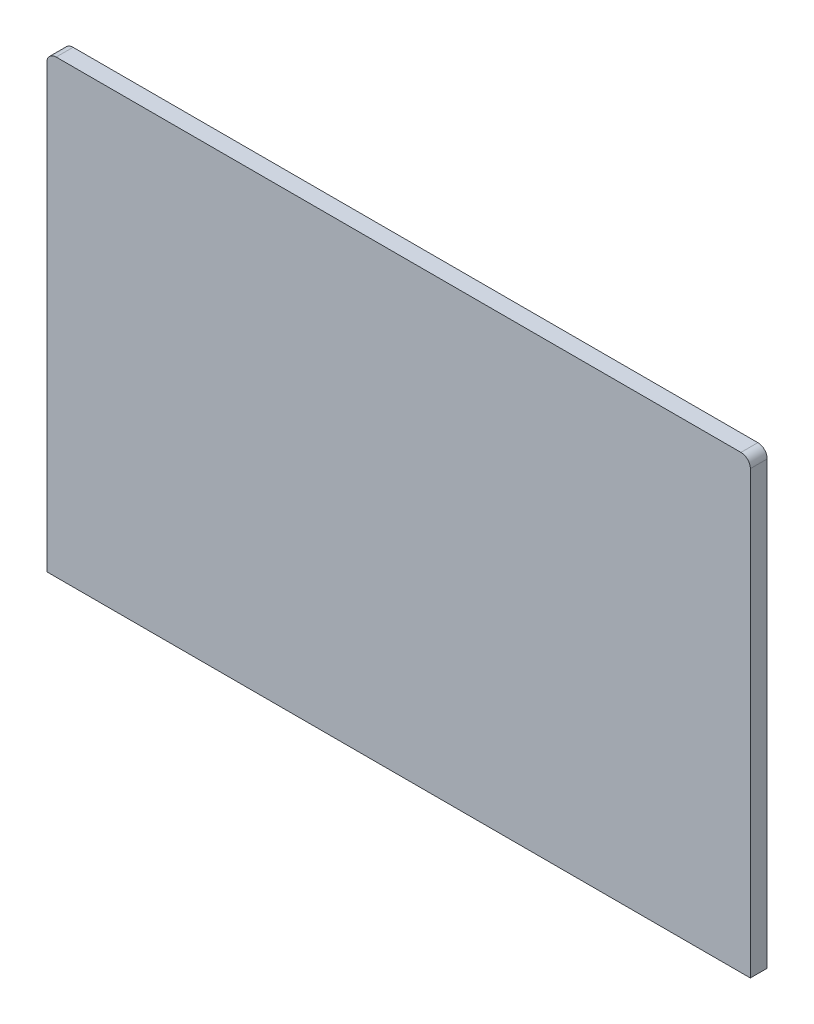
ISO-10303-21;
HEADER;
FILE_DESCRIPTION(('STEP AP214'),'2;1');
FILE_NAME('part.step','',(''),(''),'','','');
FILE_SCHEMA(('AUTOMOTIVE_DESIGN { 1 0 10303 214 1 1 1 1 }'));
ENDSEC;
DATA;
#1=APPLICATION_CONTEXT('core data for automotive mechanical design processes');
#2=APPLICATION_PROTOCOL_DEFINITION('international standard','automotive_design',2000,#1);
#3=PRODUCT_CONTEXT('',#1,'mechanical');
#4=PRODUCT('Part','Part','',(#3));
#5=PRODUCT_RELATED_PRODUCT_CATEGORY('part','',(#4));
#6=PRODUCT_DEFINITION_FORMATION('','',#4);
#7=PRODUCT_DEFINITION_CONTEXT('part definition',#1,'design');
#8=PRODUCT_DEFINITION('design','',#6,#7);
#9=PRODUCT_DEFINITION_SHAPE('','',#8);
#10=(LENGTH_UNIT() NAMED_UNIT(*) SI_UNIT(.MILLI.,.METRE.));
#11=(NAMED_UNIT(*) PLANE_ANGLE_UNIT() SI_UNIT($,.RADIAN.));
#12=(NAMED_UNIT(*) SI_UNIT($,.STERADIAN.) SOLID_ANGLE_UNIT());
#13=UNCERTAINTY_MEASURE_WITH_UNIT(LENGTH_MEASURE(1.E-05),#10,'distance_accuracy_value','');
#14=(GEOMETRIC_REPRESENTATION_CONTEXT(3) GLOBAL_UNCERTAINTY_ASSIGNED_CONTEXT((#13)) GLOBAL_UNIT_ASSIGNED_CONTEXT((#10,
#11,#12)) REPRESENTATION_CONTEXT('',''));
#15=CARTESIAN_POINT('',(0.,0.,0.));
#16=DIRECTION('',(0.,0.,1.));
#17=DIRECTION('',(1.,0.,0.));
#18=AXIS2_PLACEMENT_3D('',#15,#16,#17);
#19=CARTESIAN_POINT('',(-37.475,23.995,1.8));
#20=DIRECTION('',(1.,0.,0.));
#21=DIRECTION('',(0.,0.,-1.));
#22=AXIS2_PLACEMENT_3D('',#19,#20,#21);
#23=PLANE('',#22);
#24=DIRECTION('',(0.,-1.,0.));
#25=VECTOR('',#24,1.);
#26=CARTESIAN_POINT('',(-37.475,23.995,1.8));
#27=LINE('',#26,#25);
#28=CARTESIAN_POINT('',(-37.475,22.995,1.8));
#29=VERTEX_POINT('',#28);
#30=CARTESIAN_POINT('',(-37.475,-23.995,1.8));
#31=VERTEX_POINT('',#30);
#32=EDGE_CURVE('E93',#29,#31,#27,.T.);
#33=ORIENTED_EDGE('',*,*,#32,.F.);
#34=DIRECTION('',(0.,0.,-1.));
#35=VECTOR('',#34,1.);
#36=CARTESIAN_POINT('',(-37.475,22.995,1.8));
#37=LINE('',#36,#35);
#38=CARTESIAN_POINT('',(-37.475,22.995,0.));
#39=VERTEX_POINT('',#38);
#40=EDGE_CURVE('E116',#29,#39,#37,.T.);
#41=ORIENTED_EDGE('',*,*,#40,.T.);
#42=DIRECTION('',(0.,-1.,0.));
#43=VECTOR('',#42,1.);
#44=CARTESIAN_POINT('',(-37.475,23.995,0.));
#45=LINE('',#44,#43);
#46=CARTESIAN_POINT('',(-37.475,-23.995,0.));
#47=VERTEX_POINT('',#46);
#48=EDGE_CURVE('E114',#39,#47,#45,.T.);
#49=ORIENTED_EDGE('',*,*,#48,.T.);
#50=DIRECTION('',(0.,0.,-1.));
#51=VECTOR('',#50,1.);
#52=CARTESIAN_POINT('',(-37.475,-23.995,1.8));
#53=LINE('',#52,#51);
#54=EDGE_CURVE('E108',#31,#47,#53,.T.);
#55=ORIENTED_EDGE('',*,*,#54,.F.);
#56=EDGE_LOOP('',(#33,#41,#49,#55));
#57=FACE_BOUND('',#56,.T.);
#58=ADVANCED_FACE('F39',(#57),#23,.F.);
#59=CARTESIAN_POINT('',(37.475,-23.995,1.8));
#60=DIRECTION('',(0.,1.,0.));
#61=DIRECTION('',(-1.,0.,0.));
#62=AXIS2_PLACEMENT_3D('',#59,#60,#61);
#63=PLANE('',#62);
#64=DIRECTION('',(1.,0.,0.));
#65=VECTOR('',#64,1.);
#66=CARTESIAN_POINT('',(37.475,-23.995,0.));
#67=LINE('',#66,#65);
#68=CARTESIAN_POINT('',(37.475,-23.995,0.));
#69=VERTEX_POINT('',#68);
#70=EDGE_CURVE('E143',#47,#69,#67,.T.);
#71=ORIENTED_EDGE('',*,*,#70,.T.);
#72=DIRECTION('',(0.,0.,-1.));
#73=VECTOR('',#72,1.);
#74=CARTESIAN_POINT('',(37.475,-23.995,1.8));
#75=LINE('',#74,#73);
#76=CARTESIAN_POINT('',(37.475,-23.995,1.8));
#77=VERTEX_POINT('',#76);
#78=EDGE_CURVE('E110',#77,#69,#75,.T.);
#79=ORIENTED_EDGE('',*,*,#78,.F.);
#80=DIRECTION('',(1.,0.,0.));
#81=VECTOR('',#80,1.);
#82=CARTESIAN_POINT('',(37.475,-23.995,1.8));
#83=LINE('',#82,#81);
#84=EDGE_CURVE('E96',#31,#77,#83,.T.);
#85=ORIENTED_EDGE('',*,*,#84,.F.);
#86=ORIENTED_EDGE('',*,*,#54,.T.);
#87=EDGE_LOOP('',(#71,#79,#85,#86));
#88=FACE_BOUND('',#87,.T.);
#89=ADVANCED_FACE('F107',(#88),#63,.F.);
#90=CARTESIAN_POINT('',(37.475,23.995,1.8));
#91=DIRECTION('',(-1.,0.,0.));
#92=DIRECTION('',(0.,-1.,0.));
#93=AXIS2_PLACEMENT_3D('',#90,#91,#92);
#94=PLANE('',#93);
#95=DIRECTION('',(0.,1.,0.));
#96=VECTOR('',#95,1.);
#97=CARTESIAN_POINT('',(37.475,23.995,0.));
#98=LINE('',#97,#96);
#99=CARTESIAN_POINT('',(37.475,22.995,0.));
#100=VERTEX_POINT('',#99);
#101=EDGE_CURVE('E141',#69,#100,#98,.T.);
#102=ORIENTED_EDGE('',*,*,#101,.T.);
#103=DIRECTION('',(0.,0.,-1.));
#104=VECTOR('',#103,1.);
#105=CARTESIAN_POINT('',(37.475,22.995,1.8));
#106=LINE('',#105,#104);
#107=CARTESIAN_POINT('',(37.475,22.995,1.8));
#108=VERTEX_POINT('',#107);
#109=EDGE_CURVE('E11',#100,#108,#106,.F.);
#110=ORIENTED_EDGE('',*,*,#109,.T.);
#111=DIRECTION('',(0.,1.,0.));
#112=VECTOR('',#111,1.);
#113=CARTESIAN_POINT('',(37.475,23.995,1.8));
#114=LINE('',#113,#112);
#115=EDGE_CURVE('E111',#77,#108,#114,.T.);
#116=ORIENTED_EDGE('',*,*,#115,.F.);
#117=ORIENTED_EDGE('',*,*,#78,.T.);
#118=EDGE_LOOP('',(#102,#110,#116,#117));
#119=FACE_BOUND('',#118,.T.);
#120=ADVANCED_FACE('F142',(#119),#94,.F.);
#121=CARTESIAN_POINT('',(37.475,23.995,1.8));
#122=DIRECTION('',(0.,-1.,0.));
#123=DIRECTION('',(1.,0.,0.));
#124=AXIS2_PLACEMENT_3D('',#121,#122,#123);
#125=PLANE('',#124);
#126=DIRECTION('',(-1.,0.,0.));
#127=VECTOR('',#126,1.);
#128=CARTESIAN_POINT('',(37.475,23.995,0.));
#129=LINE('',#128,#127);
#130=CARTESIAN_POINT('',(36.475,23.995,0.));
#131=VERTEX_POINT('',#130);
#132=CARTESIAN_POINT('',(-36.475,23.995,0.));
#133=VERTEX_POINT('',#132);
#134=EDGE_CURVE('E103',#131,#133,#129,.T.);
#135=ORIENTED_EDGE('',*,*,#134,.T.);
#136=DIRECTION('',(0.,0.,-1.));
#137=VECTOR('',#136,1.);
#138=CARTESIAN_POINT('',(-36.475,23.995,1.8));
#139=LINE('',#138,#137);
#140=CARTESIAN_POINT('',(-36.475,23.995,1.8));
#141=VERTEX_POINT('',#140);
#142=EDGE_CURVE('E60',#133,#141,#139,.F.);
#143=ORIENTED_EDGE('',*,*,#142,.T.);
#144=DIRECTION('',(-1.,0.,0.));
#145=VECTOR('',#144,1.);
#146=CARTESIAN_POINT('',(37.475,23.995,1.8));
#147=LINE('',#146,#145);
#148=CARTESIAN_POINT('',(36.475,23.995,1.8));
#149=VERTEX_POINT('',#148);
#150=EDGE_CURVE('E120',#149,#141,#147,.T.);
#151=ORIENTED_EDGE('',*,*,#150,.F.);
#152=DIRECTION('',(0.,0.,-1.));
#153=VECTOR('',#152,1.);
#154=CARTESIAN_POINT('',(36.475,23.995,1.8));
#155=LINE('',#154,#153);
#156=EDGE_CURVE('E127',#149,#131,#155,.T.);
#157=ORIENTED_EDGE('',*,*,#156,.T.);
#158=EDGE_LOOP('',(#135,#143,#151,#157));
#159=FACE_BOUND('',#158,.T.);
#160=ADVANCED_FACE('F135',(#159),#125,.F.);
#161=CARTESIAN_POINT('',(0.,0.,1.8));
#162=DIRECTION('',(0.,0.,-1.));
#163=DIRECTION('',(-1.,0.,0.));
#164=AXIS2_PLACEMENT_3D('',#161,#162,#163);
#165=PLANE('',#164);
#166=ORIENTED_EDGE('',*,*,#150,.T.);
#167=CARTESIAN_POINT('',(-36.475,22.995,1.8));
#168=DIRECTION('',(0.,0.,-1.));
#169=DIRECTION('',(-1.,0.,0.));
#170=AXIS2_PLACEMENT_3D('',#167,#168,#169);
#171=CIRCLE('',#170,1.);
#172=EDGE_CURVE('E47',#141,#29,#171,.F.);
#173=ORIENTED_EDGE('',*,*,#172,.T.);
#174=ORIENTED_EDGE('',*,*,#32,.T.);
#175=ORIENTED_EDGE('',*,*,#84,.T.);
#176=ORIENTED_EDGE('',*,*,#115,.T.);
#177=CARTESIAN_POINT('',(36.475,22.995,1.8));
#178=DIRECTION('',(0.,0.,-1.));
#179=DIRECTION('',(-1.,0.,0.));
#180=AXIS2_PLACEMENT_3D('',#177,#178,#179);
#181=CIRCLE('',#180,1.);
#182=EDGE_CURVE('E131',#108,#149,#181,.F.);
#183=ORIENTED_EDGE('',*,*,#182,.T.);
#184=EDGE_LOOP('',(#166,#173,#174,#175,#176,#183));
#185=FACE_BOUND('',#184,.T.);
#186=ADVANCED_FACE('F95',(#185),#165,.F.);
#187=CARTESIAN_POINT('',(0.,0.,0.));
#188=DIRECTION('',(0.,0.,-1.));
#189=DIRECTION('',(-1.,0.,0.));
#190=AXIS2_PLACEMENT_3D('',#187,#188,#189);
#191=PLANE('',#190);
#192=ORIENTED_EDGE('',*,*,#48,.F.);
#193=CARTESIAN_POINT('',(-36.475,22.995,0.));
#194=DIRECTION('',(0.,0.,-1.));
#195=DIRECTION('',(-1.,0.,0.));
#196=AXIS2_PLACEMENT_3D('',#193,#194,#195);
#197=CIRCLE('',#196,1.);
#198=EDGE_CURVE('E125',#39,#133,#197,.T.);
#199=ORIENTED_EDGE('',*,*,#198,.T.);
#200=ORIENTED_EDGE('',*,*,#134,.F.);
#201=CARTESIAN_POINT('',(36.475,22.995,0.));
#202=DIRECTION('',(0.,0.,-1.));
#203=DIRECTION('',(-1.,0.,0.));
#204=AXIS2_PLACEMENT_3D('',#201,#202,#203);
#205=CIRCLE('',#204,1.);
#206=EDGE_CURVE('E118',#131,#100,#205,.T.);
#207=ORIENTED_EDGE('',*,*,#206,.T.);
#208=ORIENTED_EDGE('',*,*,#101,.F.);
#209=ORIENTED_EDGE('',*,*,#70,.F.);
#210=EDGE_LOOP('',(#192,#199,#200,#207,#208,#209));
#211=FACE_BOUND('',#210,.T.);
#212=ADVANCED_FACE('F140',(#211),#191,.T.);
#213=CARTESIAN_POINT('',(-36.475,22.995,1.8));
#214=DIRECTION('',(0.,0.,-1.));
#215=DIRECTION('',(-1.,0.,0.));
#216=AXIS2_PLACEMENT_3D('',#213,#214,#215);
#217=CYLINDRICAL_SURFACE('',#216,1.);
#218=ORIENTED_EDGE('',*,*,#172,.F.);
#219=ORIENTED_EDGE('',*,*,#142,.F.);
#220=ORIENTED_EDGE('',*,*,#198,.F.);
#221=ORIENTED_EDGE('',*,*,#40,.F.);
#222=EDGE_LOOP('',(#218,#219,#220,#221));
#223=FACE_BOUND('',#222,.T.);
#224=ADVANCED_FACE('F149',(#223),#217,.T.);
#225=CARTESIAN_POINT('',(36.475,22.995,1.8));
#226=DIRECTION('',(0.,0.,-1.));
#227=DIRECTION('',(-1.,0.,0.));
#228=AXIS2_PLACEMENT_3D('',#225,#226,#227);
#229=CYLINDRICAL_SURFACE('',#228,1.);
#230=ORIENTED_EDGE('',*,*,#182,.F.);
#231=ORIENTED_EDGE('',*,*,#109,.F.);
#232=ORIENTED_EDGE('',*,*,#206,.F.);
#233=ORIENTED_EDGE('',*,*,#156,.F.);
#234=EDGE_LOOP('',(#230,#231,#232,#233));
#235=FACE_BOUND('',#234,.T.);
#236=ADVANCED_FACE('F41',(#235),#229,.T.);
#237=CLOSED_SHELL('',(#58,#89,#120,#160,#186,#212,#224,#236));
#238=MANIFOLD_SOLID_BREP('B2',#237);
#239=ADVANCED_BREP_SHAPE_REPRESENTATION('',(#18,#238),#14);
#240=SHAPE_DEFINITION_REPRESENTATION(#9,#239);
ENDSEC;
END-ISO-10303-21;
